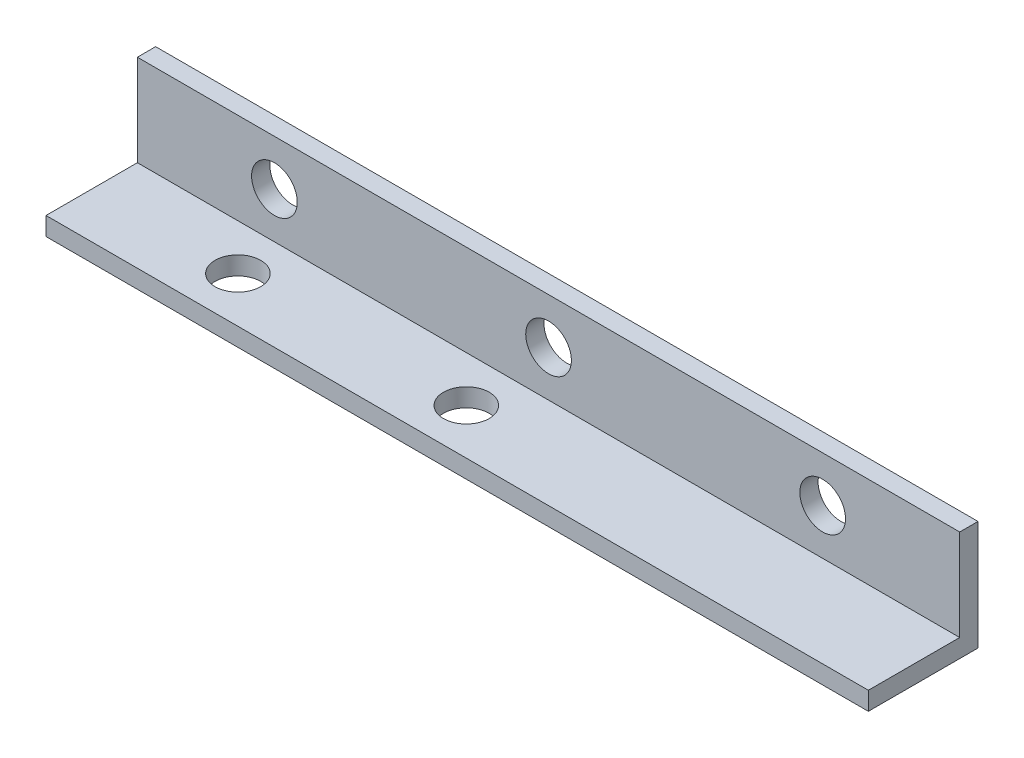
ISO-10303-21;
HEADER;
FILE_DESCRIPTION(('STEP AP214'),'2;1');
FILE_NAME('part.step','',(''),(''),'','','');
FILE_SCHEMA(('AUTOMOTIVE_DESIGN { 1 0 10303 214 1 1 1 1 }'));
ENDSEC;
DATA;
#1=APPLICATION_CONTEXT('core data for automotive mechanical design processes');
#2=APPLICATION_PROTOCOL_DEFINITION('international standard','automotive_design',2000,#1);
#3=PRODUCT_CONTEXT('',#1,'mechanical');
#4=PRODUCT('Part','Part','',(#3));
#5=PRODUCT_RELATED_PRODUCT_CATEGORY('part','',(#4));
#6=PRODUCT_DEFINITION_FORMATION('','',#4);
#7=PRODUCT_DEFINITION_CONTEXT('part definition',#1,'design');
#8=PRODUCT_DEFINITION('design','',#6,#7);
#9=PRODUCT_DEFINITION_SHAPE('','',#8);
#10=(LENGTH_UNIT() NAMED_UNIT(*) SI_UNIT(.MILLI.,.METRE.));
#11=(NAMED_UNIT(*) PLANE_ANGLE_UNIT() SI_UNIT($,.RADIAN.));
#12=(NAMED_UNIT(*) SI_UNIT($,.STERADIAN.) SOLID_ANGLE_UNIT());
#13=UNCERTAINTY_MEASURE_WITH_UNIT(LENGTH_MEASURE(1.E-05),#10,'distance_accuracy_value','');
#14=(GEOMETRIC_REPRESENTATION_CONTEXT(3) GLOBAL_UNCERTAINTY_ASSIGNED_CONTEXT((#13)) GLOBAL_UNIT_ASSIGNED_CONTEXT((#10,
#11,#12)) REPRESENTATION_CONTEXT('',''));
#15=CARTESIAN_POINT('',(0.,0.,0.));
#16=DIRECTION('',(0.,0.,1.));
#17=DIRECTION('',(1.,0.,0.));
#18=AXIS2_PLACEMENT_3D('',#15,#16,#17);
#19=CARTESIAN_POINT('',(0.,2.,0.));
#20=DIRECTION('',(0.,-1.,0.));
#21=DIRECTION('',(0.,0.,-1.));
#22=AXIS2_PLACEMENT_3D('',#19,#20,#21);
#23=PLANE('',#22);
#24=CARTESIAN_POINT('',(-45.1666666666666,2.,-0.416666666666659));
#25=DIRECTION('',(0.,-1.,0.));
#26=DIRECTION('',(0.,0.,-1.));
#27=AXIS2_PLACEMENT_3D('',#24,#25,#26);
#28=CIRCLE('',#27,2.49999999999999);
#29=CARTESIAN_POINT('',(-45.1666666666666,2.,-2.91666666666665));
#30=VERTEX_POINT('',#29);
#31=EDGE_CURVE('E158',#30,#30,#28,.T.);
#32=ORIENTED_EDGE('',*,*,#31,.T.);
#33=EDGE_LOOP('',(#32));
#34=FACE_BOUND('',#33,.T.);
#35=CARTESIAN_POINT('',(-20.1666666666666,2.,-0.416666666666659));
#36=DIRECTION('',(0.,-1.,0.));
#37=DIRECTION('',(0.,0.,-1.));
#38=AXIS2_PLACEMENT_3D('',#35,#36,#37);
#39=CIRCLE('',#38,2.5);
#40=CARTESIAN_POINT('',(-20.1666666666666,2.,-2.91666666666666));
#41=VERTEX_POINT('',#40);
#42=EDGE_CURVE('E151',#41,#41,#39,.T.);
#43=ORIENTED_EDGE('',*,*,#42,.T.);
#44=EDGE_LOOP('',(#43));
#45=FACE_BOUND('',#44,.T.);
#46=DIRECTION('',(1.,0.,0.));
#47=VECTOR('',#46,1.);
#48=CARTESIAN_POINT('',(-61.1666666666666,2.,-5.41666666666666));
#49=LINE('',#48,#47);
#50=CARTESIAN_POINT('',(-61.1666666666666,2.,-5.41666666666666));
#51=VERTEX_POINT('',#50);
#52=CARTESIAN_POINT('',(28.8333333333334,2.,-5.41666666666666));
#53=VERTEX_POINT('',#52);
#54=EDGE_CURVE('E56',#51,#53,#49,.T.);
#55=ORIENTED_EDGE('',*,*,#54,.F.);
#56=DIRECTION('',(0.,0.,1.));
#57=VECTOR('',#56,1.);
#58=CARTESIAN_POINT('',(-61.1666666666666,2.,4.58333333333334));
#59=LINE('',#58,#57);
#60=CARTESIAN_POINT('',(-61.1666666666666,2.,4.58333333333334));
#61=VERTEX_POINT('',#60);
#62=EDGE_CURVE('E183',#51,#61,#59,.T.);
#63=ORIENTED_EDGE('',*,*,#62,.T.);
#64=DIRECTION('',(1.,0.,0.));
#65=VECTOR('',#64,1.);
#66=CARTESIAN_POINT('',(-61.1666666666666,2.,4.58333333333334));
#67=LINE('',#66,#65);
#68=CARTESIAN_POINT('',(28.8333333333334,2.,4.58333333333334));
#69=VERTEX_POINT('',#68);
#70=EDGE_CURVE('E62',#61,#69,#67,.T.);
#71=ORIENTED_EDGE('',*,*,#70,.T.);
#72=DIRECTION('',(0.,0.,-1.));
#73=VECTOR('',#72,1.);
#74=CARTESIAN_POINT('',(28.8333333333334,2.,4.58333333333334));
#75=LINE('',#74,#73);
#76=EDGE_CURVE('E92',#69,#53,#75,.T.);
#77=ORIENTED_EDGE('',*,*,#76,.T.);
#78=EDGE_LOOP('',(#55,#63,#71,#77));
#79=FACE_BOUND('',#78,.T.);
#80=ADVANCED_FACE('F38',(#34,#45,#79),#23,.F.);
#81=CARTESIAN_POINT('',(28.8333333333334,2.,4.58333333333334));
#82=DIRECTION('',(-1.,0.,0.));
#83=DIRECTION('',(0.,0.,1.));
#84=AXIS2_PLACEMENT_3D('',#81,#82,#83);
#85=PLANE('',#84);
#86=DIRECTION('',(0.,0.,-1.));
#87=VECTOR('',#86,1.);
#88=CARTESIAN_POINT('',(28.8333333333334,0.,4.58333333333334));
#89=LINE('',#88,#87);
#90=CARTESIAN_POINT('',(28.8333333333334,0.,4.58333333333334));
#91=VERTEX_POINT('',#90);
#92=CARTESIAN_POINT('',(28.8333333333334,0.,-7.41666666666666));
#93=VERTEX_POINT('',#92);
#94=EDGE_CURVE('E98',#91,#93,#89,.T.);
#95=ORIENTED_EDGE('',*,*,#94,.T.);
#96=DIRECTION('',(0.,-1.,0.));
#97=VECTOR('',#96,1.);
#98=CARTESIAN_POINT('',(28.8333333333334,2.,-7.41666666666666));
#99=LINE('',#98,#97);
#100=CARTESIAN_POINT('',(28.8333333333334,12.,-7.41666666666666));
#101=VERTEX_POINT('',#100);
#102=EDGE_CURVE('E11',#101,#93,#99,.T.);
#103=ORIENTED_EDGE('',*,*,#102,.F.);
#104=DIRECTION('',(0.,0.,-1.));
#105=VECTOR('',#104,1.);
#106=CARTESIAN_POINT('',(28.8333333333334,12.,-7.41666666666666));
#107=LINE('',#106,#105);
#108=CARTESIAN_POINT('',(28.8333333333334,12.,-5.41666666666666));
#109=VERTEX_POINT('',#108);
#110=EDGE_CURVE('E170',#109,#101,#107,.T.);
#111=ORIENTED_EDGE('',*,*,#110,.F.);
#112=DIRECTION('',(0.,-1.,0.));
#113=VECTOR('',#112,1.);
#114=CARTESIAN_POINT('',(28.8333333333334,12.,-5.41666666666666));
#115=LINE('',#114,#113);
#116=EDGE_CURVE('E111',#109,#53,#115,.T.);
#117=ORIENTED_EDGE('',*,*,#116,.T.);
#118=ORIENTED_EDGE('',*,*,#76,.F.);
#119=DIRECTION('',(0.,-1.,0.));
#120=VECTOR('',#119,1.);
#121=CARTESIAN_POINT('',(28.8333333333334,2.,4.58333333333334));
#122=LINE('',#121,#120);
#123=EDGE_CURVE('E84',#69,#91,#122,.T.);
#124=ORIENTED_EDGE('',*,*,#123,.T.);
#125=EDGE_LOOP('',(#95,#103,#111,#117,#118,#124));
#126=FACE_BOUND('',#125,.T.);
#127=ADVANCED_FACE('F40',(#126),#85,.F.);
#128=CARTESIAN_POINT('',(-61.1666666666666,2.,-7.41666666666666));
#129=DIRECTION('',(0.,0.,1.));
#130=DIRECTION('',(1.,0.,0.));
#131=AXIS2_PLACEMENT_3D('',#128,#129,#130);
#132=PLANE('',#131);
#133=CARTESIAN_POINT('',(13.8333333333334,7.,-7.41666666666666));
#134=DIRECTION('',(0.,0.,1.));
#135=DIRECTION('',(1.,0.,0.));
#136=AXIS2_PLACEMENT_3D('',#133,#134,#135);
#137=CIRCLE('',#136,2.5);
#138=CARTESIAN_POINT('',(11.3333333333334,7.,-7.41666666666666));
#139=VERTEX_POINT('',#138);
#140=EDGE_CURVE('E142',#139,#139,#137,.T.);
#141=ORIENTED_EDGE('',*,*,#140,.T.);
#142=EDGE_LOOP('',(#141));
#143=FACE_BOUND('',#142,.T.);
#144=CARTESIAN_POINT('',(-16.1666666666666,7.,-7.41666666666666));
#145=DIRECTION('',(0.,0.,1.));
#146=DIRECTION('',(1.,0.,0.));
#147=AXIS2_PLACEMENT_3D('',#144,#145,#146);
#148=CIRCLE('',#147,2.5);
#149=CARTESIAN_POINT('',(-18.6666666666666,7.,-7.41666666666666));
#150=VERTEX_POINT('',#149);
#151=EDGE_CURVE('E130',#150,#150,#148,.T.);
#152=ORIENTED_EDGE('',*,*,#151,.T.);
#153=EDGE_LOOP('',(#152));
#154=FACE_BOUND('',#153,.T.);
#155=CARTESIAN_POINT('',(-46.1666666666666,7.,-7.41666666666666));
#156=DIRECTION('',(0.,0.,1.));
#157=DIRECTION('',(1.,0.,0.));
#158=AXIS2_PLACEMENT_3D('',#155,#156,#157);
#159=CIRCLE('',#158,2.5);
#160=CARTESIAN_POINT('',(-48.6666666666666,7.,-7.41666666666666));
#161=VERTEX_POINT('',#160);
#162=EDGE_CURVE('E126',#161,#161,#159,.T.);
#163=ORIENTED_EDGE('',*,*,#162,.T.);
#164=EDGE_LOOP('',(#163));
#165=FACE_BOUND('',#164,.T.);
#166=DIRECTION('',(-1.,0.,0.));
#167=VECTOR('',#166,1.);
#168=CARTESIAN_POINT('',(-61.1666666666666,0.,-7.41666666666666));
#169=LINE('',#168,#167);
#170=CARTESIAN_POINT('',(-61.1666666666666,0.,-7.41666666666666));
#171=VERTEX_POINT('',#170);
#172=EDGE_CURVE('E103',#93,#171,#169,.T.);
#173=ORIENTED_EDGE('',*,*,#172,.T.);
#174=DIRECTION('',(0.,-1.,0.));
#175=VECTOR('',#174,1.);
#176=CARTESIAN_POINT('',(-61.1666666666666,2.,-7.41666666666666));
#177=LINE('',#176,#175);
#178=CARTESIAN_POINT('',(-61.1666666666666,12.,-7.41666666666666));
#179=VERTEX_POINT('',#178);
#180=EDGE_CURVE('E48',#179,#171,#177,.T.);
#181=ORIENTED_EDGE('',*,*,#180,.F.);
#182=DIRECTION('',(-1.,0.,0.));
#183=VECTOR('',#182,1.);
#184=CARTESIAN_POINT('',(-61.1666666666666,12.,-7.41666666666666));
#185=LINE('',#184,#183);
#186=EDGE_CURVE('E174',#101,#179,#185,.T.);
#187=ORIENTED_EDGE('',*,*,#186,.F.);
#188=ORIENTED_EDGE('',*,*,#102,.T.);
#189=EDGE_LOOP('',(#173,#181,#187,#188));
#190=FACE_BOUND('',#189,.T.);
#191=ADVANCED_FACE('F193',(#143,#154,#165,#190),#132,.F.);
#192=CARTESIAN_POINT('',(-61.1666666666666,2.,4.58333333333334));
#193=DIRECTION('',(1.,0.,0.));
#194=DIRECTION('',(0.,0.,-1.));
#195=AXIS2_PLACEMENT_3D('',#192,#193,#194);
#196=PLANE('',#195);
#197=DIRECTION('',(0.,0.,1.));
#198=VECTOR('',#197,1.);
#199=CARTESIAN_POINT('',(-61.1666666666666,0.,4.58333333333334));
#200=LINE('',#199,#198);
#201=CARTESIAN_POINT('',(-61.1666666666666,0.,4.58333333333334));
#202=VERTEX_POINT('',#201);
#203=EDGE_CURVE('E93',#171,#202,#200,.T.);
#204=ORIENTED_EDGE('',*,*,#203,.T.);
#205=DIRECTION('',(0.,-1.,0.));
#206=VECTOR('',#205,1.);
#207=CARTESIAN_POINT('',(-61.1666666666666,2.,4.58333333333334));
#208=LINE('',#207,#206);
#209=EDGE_CURVE('E87',#61,#202,#208,.T.);
#210=ORIENTED_EDGE('',*,*,#209,.F.);
#211=ORIENTED_EDGE('',*,*,#62,.F.);
#212=DIRECTION('',(0.,-1.,0.));
#213=VECTOR('',#212,1.);
#214=CARTESIAN_POINT('',(-61.1666666666666,12.,-5.41666666666666));
#215=LINE('',#214,#213);
#216=CARTESIAN_POINT('',(-61.1666666666666,12.,-5.41666666666666));
#217=VERTEX_POINT('',#216);
#218=EDGE_CURVE('E105',#217,#51,#215,.T.);
#219=ORIENTED_EDGE('',*,*,#218,.F.);
#220=DIRECTION('',(0.,0.,1.));
#221=VECTOR('',#220,1.);
#222=CARTESIAN_POINT('',(-61.1666666666666,12.,-7.41666666666666));
#223=LINE('',#222,#221);
#224=EDGE_CURVE('E162',#179,#217,#223,.T.);
#225=ORIENTED_EDGE('',*,*,#224,.F.);
#226=ORIENTED_EDGE('',*,*,#180,.T.);
#227=EDGE_LOOP('',(#204,#210,#211,#219,#225,#226));
#228=FACE_BOUND('',#227,.T.);
#229=ADVANCED_FACE('F188',(#228),#196,.F.);
#230=CARTESIAN_POINT('',(-61.1666666666666,2.,4.58333333333334));
#231=DIRECTION('',(0.,0.,-1.));
#232=DIRECTION('',(-1.,0.,0.));
#233=AXIS2_PLACEMENT_3D('',#230,#231,#232);
#234=PLANE('',#233);
#235=DIRECTION('',(1.,0.,0.));
#236=VECTOR('',#235,1.);
#237=CARTESIAN_POINT('',(-61.1666666666666,0.,4.58333333333334));
#238=LINE('',#237,#236);
#239=EDGE_CURVE('E81',#202,#91,#238,.T.);
#240=ORIENTED_EDGE('',*,*,#239,.T.);
#241=ORIENTED_EDGE('',*,*,#123,.F.);
#242=ORIENTED_EDGE('',*,*,#70,.F.);
#243=ORIENTED_EDGE('',*,*,#209,.T.);
#244=EDGE_LOOP('',(#240,#241,#242,#243));
#245=FACE_BOUND('',#244,.T.);
#246=ADVANCED_FACE('F83',(#245),#234,.F.);
#247=CARTESIAN_POINT('',(0.,0.,0.));
#248=DIRECTION('',(0.,-1.,0.));
#249=DIRECTION('',(0.,0.,-1.));
#250=AXIS2_PLACEMENT_3D('',#247,#248,#249);
#251=PLANE('',#250);
#252=CARTESIAN_POINT('',(-45.1666666666666,0.,-0.416666666666659));
#253=DIRECTION('',(0.,1.,0.));
#254=DIRECTION('',(0.,0.,1.));
#255=AXIS2_PLACEMENT_3D('',#252,#253,#254);
#256=CIRCLE('',#255,2.49999999999999);
#257=CARTESIAN_POINT('',(-45.1666666666666,0.,2.08333333333334));
#258=VERTEX_POINT('',#257);
#259=EDGE_CURVE('E147',#258,#258,#256,.T.);
#260=ORIENTED_EDGE('',*,*,#259,.T.);
#261=EDGE_LOOP('',(#260));
#262=FACE_BOUND('',#261,.T.);
#263=CARTESIAN_POINT('',(-20.1666666666666,0.,-0.416666666666659));
#264=DIRECTION('',(0.,1.,0.));
#265=DIRECTION('',(0.,0.,1.));
#266=AXIS2_PLACEMENT_3D('',#263,#264,#265);
#267=CIRCLE('',#266,2.5);
#268=CARTESIAN_POINT('',(-20.1666666666666,0.,2.08333333333334));
#269=VERTEX_POINT('',#268);
#270=EDGE_CURVE('E146',#269,#269,#267,.T.);
#271=ORIENTED_EDGE('',*,*,#270,.T.);
#272=EDGE_LOOP('',(#271));
#273=FACE_BOUND('',#272,.T.);
#274=ORIENTED_EDGE('',*,*,#94,.F.);
#275=ORIENTED_EDGE('',*,*,#239,.F.);
#276=ORIENTED_EDGE('',*,*,#203,.F.);
#277=ORIENTED_EDGE('',*,*,#172,.F.);
#278=EDGE_LOOP('',(#274,#275,#276,#277));
#279=FACE_BOUND('',#278,.T.);
#280=ADVANCED_FACE('F102',(#262,#273,#279),#251,.T.);
#281=CARTESIAN_POINT('',(-61.1666666666666,12.,-5.41666666666666));
#282=DIRECTION('',(0.,0.,-1.));
#283=DIRECTION('',(-1.,0.,0.));
#284=AXIS2_PLACEMENT_3D('',#281,#282,#283);
#285=PLANE('',#284);
#286=CARTESIAN_POINT('',(13.8333333333334,7.,-5.41666666666666));
#287=DIRECTION('',(0.,0.,-1.));
#288=DIRECTION('',(-1.,0.,0.));
#289=AXIS2_PLACEMENT_3D('',#286,#287,#288);
#290=CIRCLE('',#289,2.5);
#291=CARTESIAN_POINT('',(11.3333333333334,7.,-5.41666666666666));
#292=VERTEX_POINT('',#291);
#293=EDGE_CURVE('E42',#292,#292,#290,.T.);
#294=ORIENTED_EDGE('',*,*,#293,.T.);
#295=EDGE_LOOP('',(#294));
#296=FACE_BOUND('',#295,.T.);
#297=CARTESIAN_POINT('',(-16.1666666666666,7.,-5.41666666666666));
#298=DIRECTION('',(0.,0.,-1.));
#299=DIRECTION('',(-1.,0.,0.));
#300=AXIS2_PLACEMENT_3D('',#297,#298,#299);
#301=CIRCLE('',#300,2.5);
#302=CARTESIAN_POINT('',(-18.6666666666666,7.,-5.41666666666666));
#303=VERTEX_POINT('',#302);
#304=EDGE_CURVE('E127',#303,#303,#301,.T.);
#305=ORIENTED_EDGE('',*,*,#304,.T.);
#306=EDGE_LOOP('',(#305));
#307=FACE_BOUND('',#306,.T.);
#308=CARTESIAN_POINT('',(-46.1666666666666,7.,-5.41666666666666));
#309=DIRECTION('',(0.,0.,-1.));
#310=DIRECTION('',(-1.,0.,0.));
#311=AXIS2_PLACEMENT_3D('',#308,#309,#310);
#312=CIRCLE('',#311,2.5);
#313=CARTESIAN_POINT('',(-48.6666666666666,7.,-5.41666666666666));
#314=VERTEX_POINT('',#313);
#315=EDGE_CURVE('E123',#314,#314,#312,.T.);
#316=ORIENTED_EDGE('',*,*,#315,.T.);
#317=EDGE_LOOP('',(#316));
#318=FACE_BOUND('',#317,.T.);
#319=ORIENTED_EDGE('',*,*,#54,.T.);
#320=ORIENTED_EDGE('',*,*,#116,.F.);
#321=DIRECTION('',(1.,0.,0.));
#322=VECTOR('',#321,1.);
#323=CARTESIAN_POINT('',(-61.1666666666666,12.,-5.41666666666666));
#324=LINE('',#323,#322);
#325=EDGE_CURVE('E166',#217,#109,#324,.T.);
#326=ORIENTED_EDGE('',*,*,#325,.F.);
#327=ORIENTED_EDGE('',*,*,#218,.T.);
#328=EDGE_LOOP('',(#319,#320,#326,#327));
#329=FACE_BOUND('',#328,.T.);
#330=ADVANCED_FACE('F208',(#296,#307,#318,#329),#285,.F.);
#331=CARTESIAN_POINT('',(0.,12.,0.));
#332=DIRECTION('',(0.,1.,0.));
#333=DIRECTION('',(0.,0.,1.));
#334=AXIS2_PLACEMENT_3D('',#331,#332,#333);
#335=PLANE('',#334);
#336=ORIENTED_EDGE('',*,*,#224,.T.);
#337=ORIENTED_EDGE('',*,*,#325,.T.);
#338=ORIENTED_EDGE('',*,*,#110,.T.);
#339=ORIENTED_EDGE('',*,*,#186,.T.);
#340=EDGE_LOOP('',(#336,#337,#338,#339));
#341=FACE_BOUND('',#340,.T.);
#342=ADVANCED_FACE('F197',(#341),#335,.T.);
#343=CARTESIAN_POINT('',(-20.1666666666666,0.,-0.416666666666659));
#344=DIRECTION('',(0.,1.,0.));
#345=DIRECTION('',(0.,0.,1.));
#346=AXIS2_PLACEMENT_3D('',#343,#344,#345);
#347=CYLINDRICAL_SURFACE('',#346,2.5);
#348=ORIENTED_EDGE('',*,*,#270,.F.);
#349=EDGE_LOOP('',(#348));
#350=FACE_BOUND('',#349,.T.);
#351=ORIENTED_EDGE('',*,*,#42,.F.);
#352=EDGE_LOOP('',(#351));
#353=FACE_BOUND('',#352,.T.);
#354=ADVANCED_FACE('F217',(#350,#353),#347,.F.);
#355=CARTESIAN_POINT('',(-45.1666666666666,0.,-0.416666666666659));
#356=DIRECTION('',(0.,1.,0.));
#357=DIRECTION('',(0.,0.,1.));
#358=AXIS2_PLACEMENT_3D('',#355,#356,#357);
#359=CYLINDRICAL_SURFACE('',#358,2.49999999999999);
#360=ORIENTED_EDGE('',*,*,#259,.F.);
#361=EDGE_LOOP('',(#360));
#362=FACE_BOUND('',#361,.T.);
#363=ORIENTED_EDGE('',*,*,#31,.F.);
#364=EDGE_LOOP('',(#363));
#365=FACE_BOUND('',#364,.T.);
#366=ADVANCED_FACE('F255',(#362,#365),#359,.F.);
#367=CARTESIAN_POINT('',(-46.1666666666666,7.,4.58333333333334));
#368=DIRECTION('',(0.,0.,-1.));
#369=DIRECTION('',(-1.,0.,0.));
#370=AXIS2_PLACEMENT_3D('',#367,#368,#369);
#371=CYLINDRICAL_SURFACE('',#370,2.5);
#372=CARTESIAN_POINT('',(-48.6666666666666,7.,-5.41666666666666));
#373=CARTESIAN_POINT('',(-48.6666666666666,7.,-5.43749999999999));
#374=CARTESIAN_POINT('',(-48.6666666666666,7.,-5.45833333333333));
#375=CARTESIAN_POINT('',(-48.6666666666666,7.,-5.49999999999999));
#376=CARTESIAN_POINT('',(-48.6666666666666,7.,-5.52083333333333));
#377=CARTESIAN_POINT('',(-48.6666666666666,7.,-5.56249999999999));
#378=CARTESIAN_POINT('',(-48.6666666666666,7.,-5.58333333333333));
#379=CARTESIAN_POINT('',(-48.6666666666666,7.,-5.62499999999999));
#380=CARTESIAN_POINT('',(-48.6666666666666,7.,-5.64583333333333));
#381=CARTESIAN_POINT('',(-48.6666666666666,7.,-5.68749999999999));
#382=CARTESIAN_POINT('',(-48.6666666666666,7.,-5.70833333333333));
#383=CARTESIAN_POINT('',(-48.6666666666666,7.,-5.74999999999999));
#384=CARTESIAN_POINT('',(-48.6666666666666,7.,-5.77083333333333));
#385=CARTESIAN_POINT('',(-48.6666666666666,7.,-5.81249999999999));
#386=CARTESIAN_POINT('',(-48.6666666666666,7.,-5.83333333333333));
#387=CARTESIAN_POINT('',(-48.6666666666666,7.,-5.87499999999999));
#388=CARTESIAN_POINT('',(-48.6666666666666,7.,-5.89583333333333));
#389=CARTESIAN_POINT('',(-48.6666666666666,7.,-5.93749999999999));
#390=CARTESIAN_POINT('',(-48.6666666666666,7.,-5.95833333333333));
#391=CARTESIAN_POINT('',(-48.6666666666666,7.,-5.99999999999999));
#392=CARTESIAN_POINT('',(-48.6666666666666,7.,-6.02083333333333));
#393=CARTESIAN_POINT('',(-48.6666666666666,7.,-6.06249999999999));
#394=CARTESIAN_POINT('',(-48.6666666666666,7.,-6.08333333333333));
#395=CARTESIAN_POINT('',(-48.6666666666666,7.,-6.12499999999999));
#396=CARTESIAN_POINT('',(-48.6666666666666,7.,-6.14583333333333));
#397=CARTESIAN_POINT('',(-48.6666666666666,7.,-6.18749999999999));
#398=CARTESIAN_POINT('',(-48.6666666666666,7.,-6.20833333333333));
#399=CARTESIAN_POINT('',(-48.6666666666666,7.,-6.24999999999999));
#400=CARTESIAN_POINT('',(-48.6666666666666,7.,-6.27083333333333));
#401=CARTESIAN_POINT('',(-48.6666666666666,7.,-6.31249999999999));
#402=CARTESIAN_POINT('',(-48.6666666666666,7.,-6.33333333333333));
#403=CARTESIAN_POINT('',(-48.6666666666666,7.,-6.37499999999999));
#404=CARTESIAN_POINT('',(-48.6666666666666,7.,-6.39583333333333));
#405=CARTESIAN_POINT('',(-48.6666666666666,7.,-6.43749999999999));
#406=CARTESIAN_POINT('',(-48.6666666666666,7.,-6.45833333333333));
#407=CARTESIAN_POINT('',(-48.6666666666666,7.,-6.49999999999999));
#408=CARTESIAN_POINT('',(-48.6666666666666,7.,-6.52083333333333));
#409=CARTESIAN_POINT('',(-48.6666666666666,7.,-6.56249999999999));
#410=CARTESIAN_POINT('',(-48.6666666666666,7.,-6.58333333333333));
#411=CARTESIAN_POINT('',(-48.6666666666666,7.,-6.62499999999999));
#412=CARTESIAN_POINT('',(-48.6666666666666,7.,-6.64583333333333));
#413=CARTESIAN_POINT('',(-48.6666666666666,7.,-6.68749999999999));
#414=CARTESIAN_POINT('',(-48.6666666666666,7.,-6.70833333333333));
#415=CARTESIAN_POINT('',(-48.6666666666666,7.,-6.74999999999999));
#416=CARTESIAN_POINT('',(-48.6666666666666,7.,-6.77083333333333));
#417=CARTESIAN_POINT('',(-48.6666666666666,7.,-6.81249999999999));
#418=CARTESIAN_POINT('',(-48.6666666666666,7.,-6.83333333333333));
#419=CARTESIAN_POINT('',(-48.6666666666666,7.,-6.87499999999999));
#420=CARTESIAN_POINT('',(-48.6666666666666,7.,-6.89583333333333));
#421=CARTESIAN_POINT('',(-48.6666666666666,7.,-6.93749999999999));
#422=CARTESIAN_POINT('',(-48.6666666666666,7.,-6.95833333333333));
#423=CARTESIAN_POINT('',(-48.6666666666666,7.,-6.99999999999999));
#424=CARTESIAN_POINT('',(-48.6666666666666,7.,-7.02083333333333));
#425=CARTESIAN_POINT('',(-48.6666666666666,7.,-7.06249999999999));
#426=CARTESIAN_POINT('',(-48.6666666666666,7.,-7.08333333333333));
#427=CARTESIAN_POINT('',(-48.6666666666666,7.,-7.12499999999999));
#428=CARTESIAN_POINT('',(-48.6666666666666,7.,-7.14583333333333));
#429=CARTESIAN_POINT('',(-48.6666666666666,7.,-7.18749999999999));
#430=CARTESIAN_POINT('',(-48.6666666666666,7.,-7.20833333333333));
#431=CARTESIAN_POINT('',(-48.6666666666666,7.,-7.24999999999999));
#432=CARTESIAN_POINT('',(-48.6666666666666,7.,-7.27083333333333));
#433=CARTESIAN_POINT('',(-48.6666666666666,7.,-7.31249999999999));
#434=CARTESIAN_POINT('',(-48.6666666666666,7.,-7.33333333333333));
#435=CARTESIAN_POINT('',(-48.6666666666666,7.,-7.37499999999999));
#436=CARTESIAN_POINT('',(-48.6666666666666,7.,-7.39583333333333));
#437=CARTESIAN_POINT('',(-48.6666666666666,7.,-7.41666666666666));
#438=B_SPLINE_CURVE_WITH_KNOTS('',3,(#372,#373,#374,#375,#376,#377,#378,#379,#380,#381,#382,
#383,#384,#385,#386,#387,#388,#389,#390,#391,#392,#393,#394,#395,#396,#397,#398,#399,#400,#401,
#402,#403,#404,#405,#406,#407,#408,#409,#410,#411,#412,#413,#414,#415,#416,#417,#418,#419,#420,
#421,#422,#423,#424,#425,#426,#427,#428,#429,#430,#431,#432,#433,#434,#435,#436,#437),
.UNSPECIFIED.,.F.,.F.,(4,2,2,2,2,2,2,2,2,2,2,2,2,2,2,2,2,2,2,2,2,2,2,2,2,2,2,2,2,2,2,2,4),(0.,
0.0625000000000001,0.125,0.1875,0.25,0.3125,0.375,0.4375,0.5,0.5625,0.625000000000001,
0.687500000000001,0.750000000000001,0.812500000000001,0.875000000000001,0.937500000000001,1.,
1.0625,1.125,1.1875,1.25,1.3125,1.375,1.4375,1.5,1.5625,1.625,1.6875,1.75,1.8125,1.875,1.9375,
2.),.UNSPECIFIED.);
#439=EDGE_CURVE('BSEAM246',#314,#161,#438,.T.);
#440=ORIENTED_EDGE('',*,*,#315,.F.);
#441=ORIENTED_EDGE('',*,*,#162,.F.);
#442=ORIENTED_EDGE('',*,*,#439,.T.);
#443=ORIENTED_EDGE('',*,*,#439,.F.);
#444=EDGE_LOOP('',(#440,#442,#441,#443));
#445=FACE_BOUND('',#444,.T.);
#446=ADVANCED_FACE('F246',(#445),#371,.F.);
#447=CARTESIAN_POINT('',(-16.1666666666666,7.,4.58333333333334));
#448=DIRECTION('',(0.,0.,-1.));
#449=DIRECTION('',(-1.,0.,0.));
#450=AXIS2_PLACEMENT_3D('',#447,#448,#449);
#451=CYLINDRICAL_SURFACE('',#450,2.5);
#452=CARTESIAN_POINT('',(-18.6666666666666,7.,-5.41666666666666));
#453=CARTESIAN_POINT('',(-18.6666666666666,7.,-5.43749999999999));
#454=CARTESIAN_POINT('',(-18.6666666666666,7.,-5.45833333333333));
#455=CARTESIAN_POINT('',(-18.6666666666666,7.,-5.49999999999999));
#456=CARTESIAN_POINT('',(-18.6666666666666,7.,-5.52083333333333));
#457=CARTESIAN_POINT('',(-18.6666666666666,7.,-5.56249999999999));
#458=CARTESIAN_POINT('',(-18.6666666666666,7.,-5.58333333333333));
#459=CARTESIAN_POINT('',(-18.6666666666666,7.,-5.62499999999999));
#460=CARTESIAN_POINT('',(-18.6666666666666,7.,-5.64583333333333));
#461=CARTESIAN_POINT('',(-18.6666666666666,7.,-5.68749999999999));
#462=CARTESIAN_POINT('',(-18.6666666666666,7.,-5.70833333333333));
#463=CARTESIAN_POINT('',(-18.6666666666666,7.,-5.74999999999999));
#464=CARTESIAN_POINT('',(-18.6666666666666,7.,-5.77083333333333));
#465=CARTESIAN_POINT('',(-18.6666666666666,7.,-5.81249999999999));
#466=CARTESIAN_POINT('',(-18.6666666666666,7.,-5.83333333333333));
#467=CARTESIAN_POINT('',(-18.6666666666666,7.,-5.87499999999999));
#468=CARTESIAN_POINT('',(-18.6666666666666,7.,-5.89583333333333));
#469=CARTESIAN_POINT('',(-18.6666666666666,7.,-5.93749999999999));
#470=CARTESIAN_POINT('',(-18.6666666666666,7.,-5.95833333333333));
#471=CARTESIAN_POINT('',(-18.6666666666666,7.,-5.99999999999999));
#472=CARTESIAN_POINT('',(-18.6666666666666,7.,-6.02083333333333));
#473=CARTESIAN_POINT('',(-18.6666666666666,7.,-6.06249999999999));
#474=CARTESIAN_POINT('',(-18.6666666666666,7.,-6.08333333333333));
#475=CARTESIAN_POINT('',(-18.6666666666666,7.,-6.12499999999999));
#476=CARTESIAN_POINT('',(-18.6666666666666,7.,-6.14583333333333));
#477=CARTESIAN_POINT('',(-18.6666666666666,7.,-6.18749999999999));
#478=CARTESIAN_POINT('',(-18.6666666666666,7.,-6.20833333333333));
#479=CARTESIAN_POINT('',(-18.6666666666666,7.,-6.24999999999999));
#480=CARTESIAN_POINT('',(-18.6666666666666,7.,-6.27083333333333));
#481=CARTESIAN_POINT('',(-18.6666666666666,7.,-6.31249999999999));
#482=CARTESIAN_POINT('',(-18.6666666666666,7.,-6.33333333333333));
#483=CARTESIAN_POINT('',(-18.6666666666666,7.,-6.37499999999999));
#484=CARTESIAN_POINT('',(-18.6666666666666,7.,-6.39583333333333));
#485=CARTESIAN_POINT('',(-18.6666666666666,7.,-6.43749999999999));
#486=CARTESIAN_POINT('',(-18.6666666666666,7.,-6.45833333333333));
#487=CARTESIAN_POINT('',(-18.6666666666666,7.,-6.49999999999999));
#488=CARTESIAN_POINT('',(-18.6666666666666,7.,-6.52083333333333));
#489=CARTESIAN_POINT('',(-18.6666666666666,7.,-6.56249999999999));
#490=CARTESIAN_POINT('',(-18.6666666666666,7.,-6.58333333333333));
#491=CARTESIAN_POINT('',(-18.6666666666666,7.,-6.62499999999999));
#492=CARTESIAN_POINT('',(-18.6666666666666,7.,-6.64583333333333));
#493=CARTESIAN_POINT('',(-18.6666666666666,7.,-6.68749999999999));
#494=CARTESIAN_POINT('',(-18.6666666666666,7.,-6.70833333333333));
#495=CARTESIAN_POINT('',(-18.6666666666666,7.,-6.74999999999999));
#496=CARTESIAN_POINT('',(-18.6666666666666,7.,-6.77083333333333));
#497=CARTESIAN_POINT('',(-18.6666666666666,7.,-6.81249999999999));
#498=CARTESIAN_POINT('',(-18.6666666666666,7.,-6.83333333333333));
#499=CARTESIAN_POINT('',(-18.6666666666666,7.,-6.87499999999999));
#500=CARTESIAN_POINT('',(-18.6666666666666,7.,-6.89583333333333));
#501=CARTESIAN_POINT('',(-18.6666666666666,7.,-6.93749999999999));
#502=CARTESIAN_POINT('',(-18.6666666666666,7.,-6.95833333333333));
#503=CARTESIAN_POINT('',(-18.6666666666666,7.,-6.99999999999999));
#504=CARTESIAN_POINT('',(-18.6666666666666,7.,-7.02083333333333));
#505=CARTESIAN_POINT('',(-18.6666666666666,7.,-7.06249999999999));
#506=CARTESIAN_POINT('',(-18.6666666666666,7.,-7.08333333333333));
#507=CARTESIAN_POINT('',(-18.6666666666666,7.,-7.12499999999999));
#508=CARTESIAN_POINT('',(-18.6666666666666,7.,-7.14583333333333));
#509=CARTESIAN_POINT('',(-18.6666666666666,7.,-7.18749999999999));
#510=CARTESIAN_POINT('',(-18.6666666666666,7.,-7.20833333333333));
#511=CARTESIAN_POINT('',(-18.6666666666666,7.,-7.24999999999999));
#512=CARTESIAN_POINT('',(-18.6666666666666,7.,-7.27083333333333));
#513=CARTESIAN_POINT('',(-18.6666666666666,7.,-7.31249999999999));
#514=CARTESIAN_POINT('',(-18.6666666666666,7.,-7.33333333333333));
#515=CARTESIAN_POINT('',(-18.6666666666666,7.,-7.37499999999999));
#516=CARTESIAN_POINT('',(-18.6666666666666,7.,-7.39583333333333));
#517=CARTESIAN_POINT('',(-18.6666666666666,7.,-7.41666666666666));
#518=B_SPLINE_CURVE_WITH_KNOTS('',3,(#452,#453,#454,#455,#456,#457,#458,#459,#460,#461,#462,
#463,#464,#465,#466,#467,#468,#469,#470,#471,#472,#473,#474,#475,#476,#477,#478,#479,#480,#481,
#482,#483,#484,#485,#486,#487,#488,#489,#490,#491,#492,#493,#494,#495,#496,#497,#498,#499,#500,
#501,#502,#503,#504,#505,#506,#507,#508,#509,#510,#511,#512,#513,#514,#515,#516,#517),
.UNSPECIFIED.,.F.,.F.,(4,2,2,2,2,2,2,2,2,2,2,2,2,2,2,2,2,2,2,2,2,2,2,2,2,2,2,2,2,2,2,2,4),(0.,
0.0625000000000001,0.125,0.1875,0.25,0.3125,0.375,0.4375,0.5,0.5625,0.625000000000001,
0.687500000000001,0.750000000000001,0.812500000000001,0.875000000000001,0.937500000000001,1.,
1.0625,1.125,1.1875,1.25,1.3125,1.375,1.4375,1.5,1.5625,1.625,1.6875,1.75,1.8125,1.875,1.9375,
2.),.UNSPECIFIED.);
#519=EDGE_CURVE('BSEAM243',#303,#150,#518,.T.);
#520=ORIENTED_EDGE('',*,*,#304,.F.);
#521=ORIENTED_EDGE('',*,*,#151,.F.);
#522=ORIENTED_EDGE('',*,*,#519,.T.);
#523=ORIENTED_EDGE('',*,*,#519,.F.);
#524=EDGE_LOOP('',(#520,#522,#521,#523));
#525=FACE_BOUND('',#524,.T.);
#526=ADVANCED_FACE('F243',(#525),#451,.F.);
#527=CARTESIAN_POINT('',(13.8333333333334,7.,4.58333333333334));
#528=DIRECTION('',(0.,0.,-1.));
#529=DIRECTION('',(-1.,0.,0.));
#530=AXIS2_PLACEMENT_3D('',#527,#528,#529);
#531=CYLINDRICAL_SURFACE('',#530,2.5);
#532=CARTESIAN_POINT('',(11.3333333333334,7.,-5.41666666666666));
#533=CARTESIAN_POINT('',(11.3333333333334,7.,-5.43749999999999));
#534=CARTESIAN_POINT('',(11.3333333333334,7.,-5.45833333333333));
#535=CARTESIAN_POINT('',(11.3333333333334,7.,-5.49999999999999));
#536=CARTESIAN_POINT('',(11.3333333333334,7.,-5.52083333333333));
#537=CARTESIAN_POINT('',(11.3333333333334,7.,-5.56249999999999));
#538=CARTESIAN_POINT('',(11.3333333333334,7.,-5.58333333333333));
#539=CARTESIAN_POINT('',(11.3333333333334,7.,-5.62499999999999));
#540=CARTESIAN_POINT('',(11.3333333333334,7.,-5.64583333333333));
#541=CARTESIAN_POINT('',(11.3333333333334,7.,-5.68749999999999));
#542=CARTESIAN_POINT('',(11.3333333333334,7.,-5.70833333333333));
#543=CARTESIAN_POINT('',(11.3333333333334,7.,-5.74999999999999));
#544=CARTESIAN_POINT('',(11.3333333333334,7.,-5.77083333333333));
#545=CARTESIAN_POINT('',(11.3333333333334,7.,-5.81249999999999));
#546=CARTESIAN_POINT('',(11.3333333333334,7.,-5.83333333333333));
#547=CARTESIAN_POINT('',(11.3333333333334,7.,-5.87499999999999));
#548=CARTESIAN_POINT('',(11.3333333333334,7.,-5.89583333333333));
#549=CARTESIAN_POINT('',(11.3333333333334,7.,-5.93749999999999));
#550=CARTESIAN_POINT('',(11.3333333333334,7.,-5.95833333333333));
#551=CARTESIAN_POINT('',(11.3333333333334,7.,-5.99999999999999));
#552=CARTESIAN_POINT('',(11.3333333333334,7.,-6.02083333333333));
#553=CARTESIAN_POINT('',(11.3333333333334,7.,-6.06249999999999));
#554=CARTESIAN_POINT('',(11.3333333333334,7.,-6.08333333333333));
#555=CARTESIAN_POINT('',(11.3333333333334,7.,-6.12499999999999));
#556=CARTESIAN_POINT('',(11.3333333333334,7.,-6.14583333333333));
#557=CARTESIAN_POINT('',(11.3333333333334,7.,-6.18749999999999));
#558=CARTESIAN_POINT('',(11.3333333333334,7.,-6.20833333333333));
#559=CARTESIAN_POINT('',(11.3333333333334,7.,-6.24999999999999));
#560=CARTESIAN_POINT('',(11.3333333333334,7.,-6.27083333333333));
#561=CARTESIAN_POINT('',(11.3333333333334,7.,-6.31249999999999));
#562=CARTESIAN_POINT('',(11.3333333333334,7.,-6.33333333333333));
#563=CARTESIAN_POINT('',(11.3333333333334,7.,-6.37499999999999));
#564=CARTESIAN_POINT('',(11.3333333333334,7.,-6.39583333333333));
#565=CARTESIAN_POINT('',(11.3333333333334,7.,-6.43749999999999));
#566=CARTESIAN_POINT('',(11.3333333333334,7.,-6.45833333333333));
#567=CARTESIAN_POINT('',(11.3333333333334,7.,-6.49999999999999));
#568=CARTESIAN_POINT('',(11.3333333333334,7.,-6.52083333333333));
#569=CARTESIAN_POINT('',(11.3333333333334,7.,-6.56249999999999));
#570=CARTESIAN_POINT('',(11.3333333333334,7.,-6.58333333333333));
#571=CARTESIAN_POINT('',(11.3333333333334,7.,-6.62499999999999));
#572=CARTESIAN_POINT('',(11.3333333333334,7.,-6.64583333333333));
#573=CARTESIAN_POINT('',(11.3333333333334,7.,-6.68749999999999));
#574=CARTESIAN_POINT('',(11.3333333333334,7.,-6.70833333333333));
#575=CARTESIAN_POINT('',(11.3333333333334,7.,-6.74999999999999));
#576=CARTESIAN_POINT('',(11.3333333333334,7.,-6.77083333333333));
#577=CARTESIAN_POINT('',(11.3333333333334,7.,-6.81249999999999));
#578=CARTESIAN_POINT('',(11.3333333333334,7.,-6.83333333333333));
#579=CARTESIAN_POINT('',(11.3333333333334,7.,-6.87499999999999));
#580=CARTESIAN_POINT('',(11.3333333333334,7.,-6.89583333333333));
#581=CARTESIAN_POINT('',(11.3333333333334,7.,-6.93749999999999));
#582=CARTESIAN_POINT('',(11.3333333333334,7.,-6.95833333333333));
#583=CARTESIAN_POINT('',(11.3333333333334,7.,-6.99999999999999));
#584=CARTESIAN_POINT('',(11.3333333333334,7.,-7.02083333333333));
#585=CARTESIAN_POINT('',(11.3333333333334,7.,-7.06249999999999));
#586=CARTESIAN_POINT('',(11.3333333333334,7.,-7.08333333333333));
#587=CARTESIAN_POINT('',(11.3333333333334,7.,-7.12499999999999));
#588=CARTESIAN_POINT('',(11.3333333333334,7.,-7.14583333333333));
#589=CARTESIAN_POINT('',(11.3333333333334,7.,-7.18749999999999));
#590=CARTESIAN_POINT('',(11.3333333333334,7.,-7.20833333333333));
#591=CARTESIAN_POINT('',(11.3333333333334,7.,-7.24999999999999));
#592=CARTESIAN_POINT('',(11.3333333333334,7.,-7.27083333333333));
#593=CARTESIAN_POINT('',(11.3333333333334,7.,-7.31249999999999));
#594=CARTESIAN_POINT('',(11.3333333333334,7.,-7.33333333333333));
#595=CARTESIAN_POINT('',(11.3333333333334,7.,-7.37499999999999));
#596=CARTESIAN_POINT('',(11.3333333333334,7.,-7.39583333333333));
#597=CARTESIAN_POINT('',(11.3333333333334,7.,-7.41666666666666));
#598=B_SPLINE_CURVE_WITH_KNOTS('',3,(#532,#533,#534,#535,#536,#537,#538,#539,#540,#541,#542,
#543,#544,#545,#546,#547,#548,#549,#550,#551,#552,#553,#554,#555,#556,#557,#558,#559,#560,#561,
#562,#563,#564,#565,#566,#567,#568,#569,#570,#571,#572,#573,#574,#575,#576,#577,#578,#579,#580,
#581,#582,#583,#584,#585,#586,#587,#588,#589,#590,#591,#592,#593,#594,#595,#596,#597),
.UNSPECIFIED.,.F.,.F.,(4,2,2,2,2,2,2,2,2,2,2,2,2,2,2,2,2,2,2,2,2,2,2,2,2,2,2,2,2,2,2,2,4),(0.,
0.0625000000000001,0.125,0.1875,0.25,0.3125,0.375,0.4375,0.5,0.5625,0.625000000000001,
0.687500000000001,0.750000000000001,0.812500000000001,0.875000000000001,0.937500000000001,1.,
1.0625,1.125,1.1875,1.25,1.3125,1.375,1.4375,1.5,1.5625,1.625,1.6875,1.75,1.8125,1.875,1.9375,
2.),.UNSPECIFIED.);
#599=EDGE_CURVE('BSEAM245',#292,#139,#598,.T.);
#600=ORIENTED_EDGE('',*,*,#293,.F.);
#601=ORIENTED_EDGE('',*,*,#140,.F.);
#602=ORIENTED_EDGE('',*,*,#599,.T.);
#603=ORIENTED_EDGE('',*,*,#599,.F.);
#604=EDGE_LOOP('',(#600,#602,#601,#603));
#605=FACE_BOUND('',#604,.T.);
#606=ADVANCED_FACE('F245',(#605),#531,.F.);
#607=CLOSED_SHELL('',(#80,#127,#191,#229,#246,#280,#330,#342,#354,#366,#446,#526,#606));
#608=MANIFOLD_SOLID_BREP('B2',#607);
#609=ADVANCED_BREP_SHAPE_REPRESENTATION('',(#18,#608),#14);
#610=SHAPE_DEFINITION_REPRESENTATION(#9,#609);
ENDSEC;
END-ISO-10303-21;
